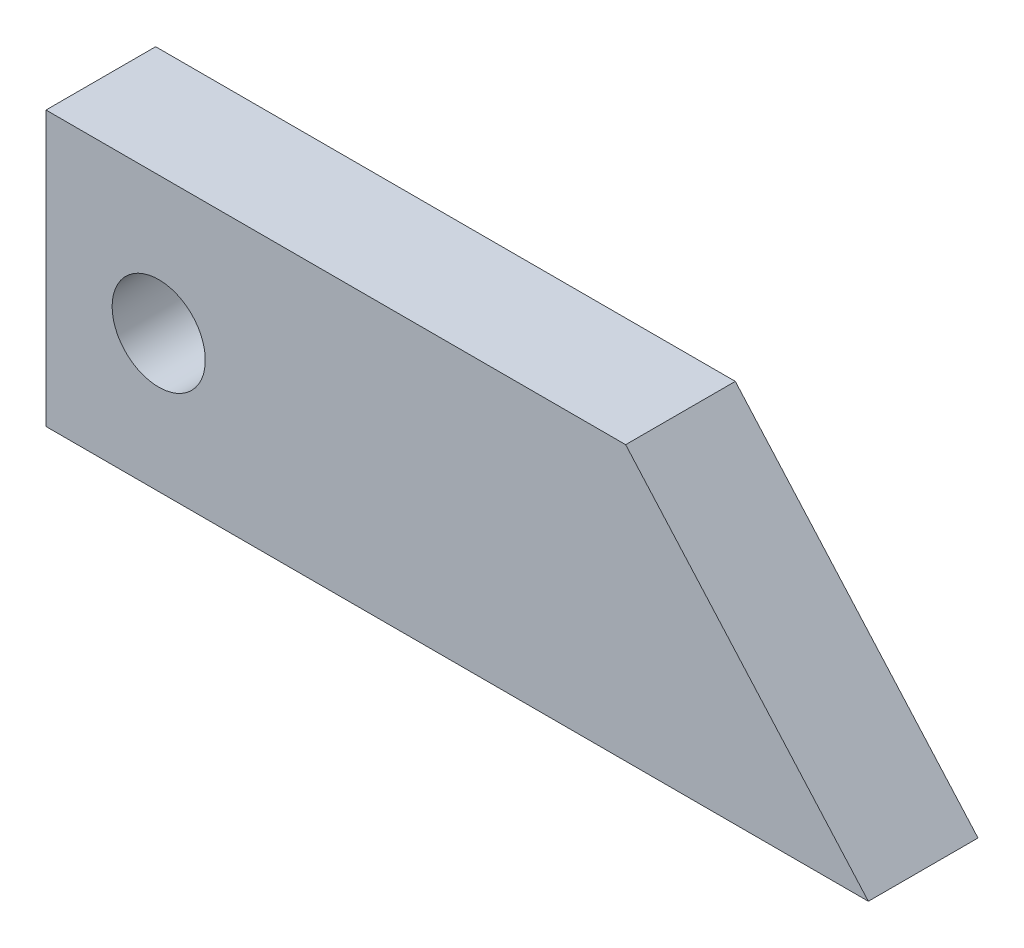
ISO-10303-21;
HEADER;
FILE_DESCRIPTION(('STEP AP214'),'2;1');
FILE_NAME('part.step','',(''),(''),'','','');
FILE_SCHEMA(('AUTOMOTIVE_DESIGN { 1 0 10303 214 1 1 1 1 }'));
ENDSEC;
DATA;
#1=APPLICATION_CONTEXT('core data for automotive mechanical design processes');
#2=APPLICATION_PROTOCOL_DEFINITION('international standard','automotive_design',2000,#1);
#3=PRODUCT_CONTEXT('',#1,'mechanical');
#4=PRODUCT('Part','Part','',(#3));
#5=PRODUCT_RELATED_PRODUCT_CATEGORY('part','',(#4));
#6=PRODUCT_DEFINITION_FORMATION('','',#4);
#7=PRODUCT_DEFINITION_CONTEXT('part definition',#1,'design');
#8=PRODUCT_DEFINITION('design','',#6,#7);
#9=PRODUCT_DEFINITION_SHAPE('','',#8);
#10=(LENGTH_UNIT() NAMED_UNIT(*) SI_UNIT(.MILLI.,.METRE.));
#11=(NAMED_UNIT(*) PLANE_ANGLE_UNIT() SI_UNIT($,.RADIAN.));
#12=(NAMED_UNIT(*) SI_UNIT($,.STERADIAN.) SOLID_ANGLE_UNIT());
#13=UNCERTAINTY_MEASURE_WITH_UNIT(LENGTH_MEASURE(1.E-05),#10,'distance_accuracy_value','');
#14=(GEOMETRIC_REPRESENTATION_CONTEXT(3) GLOBAL_UNCERTAINTY_ASSIGNED_CONTEXT((#13)) GLOBAL_UNIT_ASSIGNED_CONTEXT((#10,
#11,#12)) REPRESENTATION_CONTEXT('',''));
#15=CARTESIAN_POINT('',(0.,0.,0.));
#16=DIRECTION('',(0.,0.,1.));
#17=DIRECTION('',(1.,0.,0.));
#18=AXIS2_PLACEMENT_3D('',#15,#16,#17);
#19=CARTESIAN_POINT('',(30.,0.,4.));
#20=DIRECTION('',(0.,1.,0.));
#21=DIRECTION('',(-1.,0.,0.));
#22=AXIS2_PLACEMENT_3D('',#19,#20,#21);
#23=PLANE('',#22);
#24=DIRECTION('',(1.,0.,0.));
#25=VECTOR('',#24,1.);
#26=CARTESIAN_POINT('',(30.,0.,0.));
#27=LINE('',#26,#25);
#28=CARTESIAN_POINT('',(0.,0.,0.));
#29=VERTEX_POINT('',#28);
#30=CARTESIAN_POINT('',(30.,0.,0.));
#31=VERTEX_POINT('',#30);
#32=EDGE_CURVE('E94',#29,#31,#27,.T.);
#33=ORIENTED_EDGE('',*,*,#32,.T.);
#34=DIRECTION('',(0.,0.,-1.));
#35=VECTOR('',#34,1.);
#36=CARTESIAN_POINT('',(30.,0.,4.));
#37=LINE('',#36,#35);
#38=CARTESIAN_POINT('',(30.,0.,4.));
#39=VERTEX_POINT('',#38);
#40=EDGE_CURVE('E11',#39,#31,#37,.T.);
#41=ORIENTED_EDGE('',*,*,#40,.F.);
#42=DIRECTION('',(1.,0.,0.));
#43=VECTOR('',#42,1.);
#44=CARTESIAN_POINT('',(30.,0.,4.));
#45=LINE('',#44,#43);
#46=CARTESIAN_POINT('',(0.,0.,4.));
#47=VERTEX_POINT('',#46);
#48=EDGE_CURVE('E82',#47,#39,#45,.T.);
#49=ORIENTED_EDGE('',*,*,#48,.F.);
#50=DIRECTION('',(0.,0.,-1.));
#51=VECTOR('',#50,1.);
#52=CARTESIAN_POINT('',(0.,0.,4.));
#53=LINE('',#52,#51);
#54=EDGE_CURVE('E90',#47,#29,#53,.T.);
#55=ORIENTED_EDGE('',*,*,#54,.T.);
#56=EDGE_LOOP('',(#33,#41,#49,#55));
#57=FACE_BOUND('',#56,.T.);
#58=ADVANCED_FACE('F31',(#57),#23,.F.);
#59=CARTESIAN_POINT('',(21.1466375234579,10.,4.));
#60=DIRECTION('',(-0.748728651475381,-0.66287661480841,0.));
#61=DIRECTION('',(0.66287661480841,-0.748728651475381,0.));
#62=AXIS2_PLACEMENT_3D('',#59,#60,#61);
#63=PLANE('',#62);
#64=DIRECTION('',(-0.66287661480841,0.748728651475381,0.));
#65=VECTOR('',#64,1.);
#66=CARTESIAN_POINT('',(21.1466375234579,10.,0.));
#67=LINE('',#66,#65);
#68=CARTESIAN_POINT('',(21.1466375234579,10.,0.));
#69=VERTEX_POINT('',#68);
#70=EDGE_CURVE('E86',#31,#69,#67,.T.);
#71=ORIENTED_EDGE('',*,*,#70,.T.);
#72=DIRECTION('',(0.,0.,-1.));
#73=VECTOR('',#72,1.);
#74=CARTESIAN_POINT('',(21.1466375234579,10.,4.));
#75=LINE('',#74,#73);
#76=CARTESIAN_POINT('',(21.1466375234579,10.,4.));
#77=VERTEX_POINT('',#76);
#78=EDGE_CURVE('E39',#77,#69,#75,.T.);
#79=ORIENTED_EDGE('',*,*,#78,.F.);
#80=DIRECTION('',(-0.66287661480841,0.748728651475381,0.));
#81=VECTOR('',#80,1.);
#82=CARTESIAN_POINT('',(21.1466375234579,10.,4.));
#83=LINE('',#82,#81);
#84=EDGE_CURVE('E77',#39,#77,#83,.T.);
#85=ORIENTED_EDGE('',*,*,#84,.F.);
#86=ORIENTED_EDGE('',*,*,#40,.T.);
#87=EDGE_LOOP('',(#71,#79,#85,#86));
#88=FACE_BOUND('',#87,.T.);
#89=ADVANCED_FACE('F85',(#88),#63,.F.);
#90=CARTESIAN_POINT('',(0.,10.,4.));
#91=DIRECTION('',(0.,-1.,0.));
#92=DIRECTION('',(0.,0.,-1.));
#93=AXIS2_PLACEMENT_3D('',#90,#91,#92);
#94=PLANE('',#93);
#95=DIRECTION('',(-1.,0.,0.));
#96=VECTOR('',#95,1.);
#97=CARTESIAN_POINT('',(0.,10.,0.));
#98=LINE('',#97,#96);
#99=CARTESIAN_POINT('',(0.,10.,0.));
#100=VERTEX_POINT('',#99);
#101=EDGE_CURVE('E64',#69,#100,#98,.T.);
#102=ORIENTED_EDGE('',*,*,#101,.T.);
#103=DIRECTION('',(0.,0.,-1.));
#104=VECTOR('',#103,1.);
#105=CARTESIAN_POINT('',(0.,10.,4.));
#106=LINE('',#105,#104);
#107=CARTESIAN_POINT('',(0.,10.,4.));
#108=VERTEX_POINT('',#107);
#109=EDGE_CURVE('E87',#108,#100,#106,.T.);
#110=ORIENTED_EDGE('',*,*,#109,.F.);
#111=DIRECTION('',(-1.,0.,0.));
#112=VECTOR('',#111,1.);
#113=CARTESIAN_POINT('',(0.,10.,4.));
#114=LINE('',#113,#112);
#115=EDGE_CURVE('E80',#77,#108,#114,.T.);
#116=ORIENTED_EDGE('',*,*,#115,.F.);
#117=ORIENTED_EDGE('',*,*,#78,.T.);
#118=EDGE_LOOP('',(#102,#110,#116,#117));
#119=FACE_BOUND('',#118,.T.);
#120=ADVANCED_FACE('F88',(#119),#94,.F.);
#121=CARTESIAN_POINT('',(0.,0.,4.));
#122=DIRECTION('',(1.,0.,0.));
#123=DIRECTION('',(0.,0.,-1.));
#124=AXIS2_PLACEMENT_3D('',#121,#122,#123);
#125=PLANE('',#124);
#126=DIRECTION('',(0.,-1.,0.));
#127=VECTOR('',#126,1.);
#128=CARTESIAN_POINT('',(0.,0.,0.));
#129=LINE('',#128,#127);
#130=EDGE_CURVE('E70',#100,#29,#129,.T.);
#131=ORIENTED_EDGE('',*,*,#130,.T.);
#132=ORIENTED_EDGE('',*,*,#54,.F.);
#133=DIRECTION('',(0.,-1.,0.));
#134=VECTOR('',#133,1.);
#135=CARTESIAN_POINT('',(0.,0.,4.));
#136=LINE('',#135,#134);
#137=EDGE_CURVE('E47',#108,#47,#136,.T.);
#138=ORIENTED_EDGE('',*,*,#137,.F.);
#139=ORIENTED_EDGE('',*,*,#109,.T.);
#140=EDGE_LOOP('',(#131,#132,#138,#139));
#141=FACE_BOUND('',#140,.T.);
#142=ADVANCED_FACE('F102',(#141),#125,.F.);
#143=CARTESIAN_POINT('',(0.,0.,4.));
#144=DIRECTION('',(0.,0.,-1.));
#145=DIRECTION('',(-1.,0.,0.));
#146=AXIS2_PLACEMENT_3D('',#143,#144,#145);
#147=PLANE('',#146);
#148=CARTESIAN_POINT('',(4.11182205819523,5.,4.));
#149=DIRECTION('',(0.,0.,-1.));
#150=DIRECTION('',(-1.,0.,0.));
#151=AXIS2_PLACEMENT_3D('',#148,#149,#150);
#152=CIRCLE('',#151,1.7);
#153=CARTESIAN_POINT('',(2.41182205819523,5.,4.));
#154=VERTEX_POINT('',#153);
#155=EDGE_CURVE('E113',#154,#154,#152,.T.);
#156=ORIENTED_EDGE('',*,*,#155,.T.);
#157=EDGE_LOOP('',(#156));
#158=FACE_BOUND('',#157,.T.);
#159=ORIENTED_EDGE('',*,*,#48,.T.);
#160=ORIENTED_EDGE('',*,*,#84,.T.);
#161=ORIENTED_EDGE('',*,*,#115,.T.);
#162=ORIENTED_EDGE('',*,*,#137,.T.);
#163=EDGE_LOOP('',(#159,#160,#161,#162));
#164=FACE_BOUND('',#163,.T.);
#165=ADVANCED_FACE('F78',(#158,#164),#147,.F.);
#166=CARTESIAN_POINT('',(0.,0.,0.));
#167=DIRECTION('',(0.,0.,-1.));
#168=DIRECTION('',(-1.,0.,0.));
#169=AXIS2_PLACEMENT_3D('',#166,#167,#168);
#170=PLANE('',#169);
#171=CARTESIAN_POINT('',(4.11182205819523,5.,0.));
#172=DIRECTION('',(0.,0.,-1.));
#173=DIRECTION('',(-1.,0.,0.));
#174=AXIS2_PLACEMENT_3D('',#171,#172,#173);
#175=CIRCLE('',#174,3.15);
#176=CARTESIAN_POINT('',(0.961822058195226,5.,0.));
#177=VERTEX_POINT('',#176);
#178=EDGE_CURVE('E97',#177,#177,#175,.T.);
#179=ORIENTED_EDGE('',*,*,#178,.F.);
#180=EDGE_LOOP('',(#179));
#181=FACE_BOUND('',#180,.T.);
#182=ORIENTED_EDGE('',*,*,#32,.F.);
#183=ORIENTED_EDGE('',*,*,#130,.F.);
#184=ORIENTED_EDGE('',*,*,#101,.F.);
#185=ORIENTED_EDGE('',*,*,#70,.F.);
#186=EDGE_LOOP('',(#182,#183,#184,#185));
#187=FACE_BOUND('',#186,.T.);
#188=ADVANCED_FACE('F105',(#181,#187),#170,.T.);
#189=CARTESIAN_POINT('',(4.11182205819523,5.,0.));
#190=DIRECTION('',(0.,0.,-1.));
#191=DIRECTION('',(-1.,0.,0.));
#192=AXIS2_PLACEMENT_3D('',#189,#190,#191);
#193=CONICAL_SURFACE('',#192,3.15,0.785398163397449);
#194=CARTESIAN_POINT('',(4.11182205819523,5.,1.45));
#195=DIRECTION('',(0.,0.,-1.));
#196=DIRECTION('',(-1.,0.,0.));
#197=AXIS2_PLACEMENT_3D('',#194,#195,#196);
#198=CIRCLE('',#197,1.7);
#199=CARTESIAN_POINT('',(2.41182205819523,5.,1.45));
#200=VERTEX_POINT('',#199);
#201=EDGE_CURVE('E110',#200,#200,#198,.T.);
#202=ORIENTED_EDGE('',*,*,#201,.F.);
#203=EDGE_LOOP('',(#202));
#204=FACE_BOUND('',#203,.T.);
#205=ORIENTED_EDGE('',*,*,#178,.T.);
#206=EDGE_LOOP('',(#205));
#207=FACE_BOUND('',#206,.T.);
#208=ADVANCED_FACE('F121',(#204,#207),#193,.F.);
#209=CARTESIAN_POINT('',(4.11182205819523,5.,0.));
#210=DIRECTION('',(0.,0.,-1.));
#211=DIRECTION('',(-1.,0.,0.));
#212=AXIS2_PLACEMENT_3D('',#209,#210,#211);
#213=CYLINDRICAL_SURFACE('',#212,1.7);
#214=ORIENTED_EDGE('',*,*,#155,.F.);
#215=EDGE_LOOP('',(#214));
#216=FACE_BOUND('',#215,.T.);
#217=ORIENTED_EDGE('',*,*,#201,.T.);
#218=EDGE_LOOP('',(#217));
#219=FACE_BOUND('',#218,.T.);
#220=ADVANCED_FACE('F118',(#216,#219),#213,.F.);
#221=CLOSED_SHELL('',(#58,#89,#120,#142,#165,#188,#208,#220));
#222=MANIFOLD_SOLID_BREP('B2',#221);
#223=ADVANCED_BREP_SHAPE_REPRESENTATION('',(#18,#222),#14);
#224=SHAPE_DEFINITION_REPRESENTATION(#9,#223);
ENDSEC;
END-ISO-10303-21;
